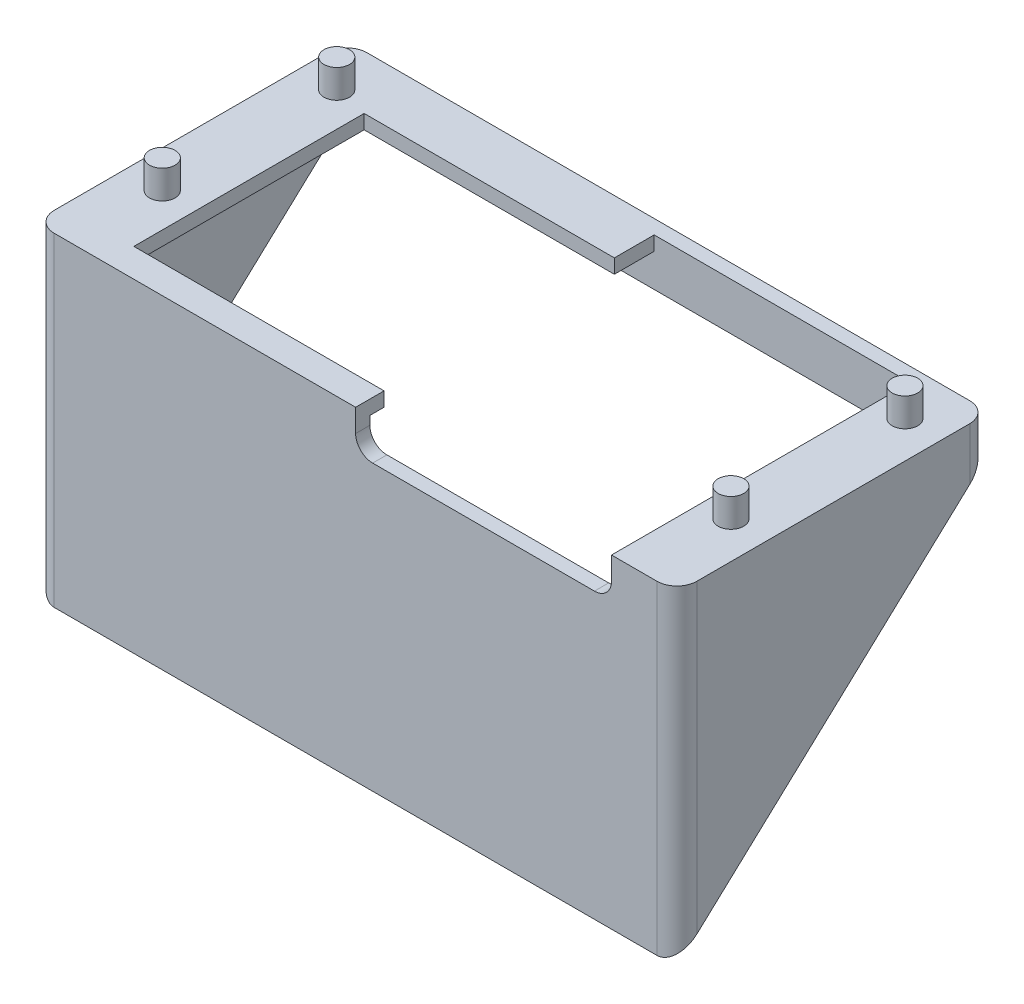
ISO-10303-21;
HEADER;
FILE_DESCRIPTION(('STEP AP214'),'2;1');
FILE_NAME('part.step','',(''),(''),'','','');
FILE_SCHEMA(('AUTOMOTIVE_DESIGN { 1 0 10303 214 1 1 1 1 }'));
ENDSEC;
DATA;
#1=APPLICATION_CONTEXT('core data for automotive mechanical design processes');
#2=APPLICATION_PROTOCOL_DEFINITION('international standard','automotive_design',2000,#1);
#3=PRODUCT_CONTEXT('',#1,'mechanical');
#4=PRODUCT('Part','Part','',(#3));
#5=PRODUCT_RELATED_PRODUCT_CATEGORY('part','',(#4));
#6=PRODUCT_DEFINITION_FORMATION('','',#4);
#7=PRODUCT_DEFINITION_CONTEXT('part definition',#1,'design');
#8=PRODUCT_DEFINITION('design','',#6,#7);
#9=PRODUCT_DEFINITION_SHAPE('','',#8);
#10=(LENGTH_UNIT() NAMED_UNIT(*) SI_UNIT(.MILLI.,.METRE.));
#11=(NAMED_UNIT(*) PLANE_ANGLE_UNIT() SI_UNIT($,.RADIAN.));
#12=(NAMED_UNIT(*) SI_UNIT($,.STERADIAN.) SOLID_ANGLE_UNIT());
#13=UNCERTAINTY_MEASURE_WITH_UNIT(LENGTH_MEASURE(1.E-05),#10,'distance_accuracy_value','');
#14=(GEOMETRIC_REPRESENTATION_CONTEXT(3) GLOBAL_UNCERTAINTY_ASSIGNED_CONTEXT((#13)) GLOBAL_UNIT_ASSIGNED_CONTEXT((#10,
#11,#12)) REPRESENTATION_CONTEXT('',''));
#15=CARTESIAN_POINT('',(0.,0.,0.));
#16=DIRECTION('',(0.,0.,1.));
#17=DIRECTION('',(1.,0.,0.));
#18=AXIS2_PLACEMENT_3D('',#15,#16,#17);
#19=CARTESIAN_POINT('',(0.,3.5,0.));
#20=DIRECTION('',(0.,1.,0.));
#21=DIRECTION('',(0.,0.,1.));
#22=AXIS2_PLACEMENT_3D('',#19,#20,#21);
#23=PLANE('',#22);
#24=DIRECTION('',(1.,0.,0.));
#25=VECTOR('',#24,1.);
#26=CARTESIAN_POINT('',(0.,3.5,9.97047970479705));
#27=LINE('',#26,#25);
#28=CARTESIAN_POINT('',(-40.0387453874539,3.5,9.97047970479705));
#29=VERTEX_POINT('',#28);
#30=CARTESIAN_POINT('',(3.96125461254611,3.5,9.97047970479705));
#31=VERTEX_POINT('',#30);
#32=EDGE_CURVE('E334',#29,#31,#27,.T.);
#33=ORIENTED_EDGE('',*,*,#32,.T.);
#34=DIRECTION('',(0.,0.,1.));
#35=VECTOR('',#34,1.);
#36=CARTESIAN_POINT('',(3.96125461254611,3.5,0.));
#37=LINE('',#36,#35);
#38=CARTESIAN_POINT('',(3.96125461254611,3.5,12.470479704797));
#39=VERTEX_POINT('',#38);
#40=EDGE_CURVE('E329',#31,#39,#37,.T.);
#41=ORIENTED_EDGE('',*,*,#40,.T.);
#42=DIRECTION('',(1.,0.,0.));
#43=VECTOR('',#42,1.);
#44=CARTESIAN_POINT('',(-52.5387453874539,3.5,12.470479704797));
#45=LINE('',#44,#43);
#46=CARTESIAN_POINT('',(-50.0387453874539,3.5,12.470479704797));
#47=VERTEX_POINT('',#46);
#48=EDGE_CURVE('E371',#47,#39,#45,.T.);
#49=ORIENTED_EDGE('',*,*,#48,.F.);
#50=DIRECTION('',(0.,0.,1.));
#51=VECTOR('',#50,1.);
#52=CARTESIAN_POINT('',(-50.0387453874539,3.5,-40.0295202952029));
#53=LINE('',#52,#51);
#54=CARTESIAN_POINT('',(-50.0387453874539,3.5,-37.5295202952029));
#55=VERTEX_POINT('',#54);
#56=EDGE_CURVE('E364',#55,#47,#53,.T.);
#57=ORIENTED_EDGE('',*,*,#56,.F.);
#58=DIRECTION('',(-1.,0.,0.));
#59=VECTOR('',#58,1.);
#60=CARTESIAN_POINT('',(-52.5387453874539,3.5,-37.5295202952029));
#61=LINE('',#60,#59);
#62=CARTESIAN_POINT('',(3.96125461254612,3.5,-37.5295202952029));
#63=VERTEX_POINT('',#62);
#64=EDGE_CURVE('E378',#63,#55,#61,.T.);
#65=ORIENTED_EDGE('',*,*,#64,.F.);
#66=DIRECTION('',(0.,0.,-1.));
#67=VECTOR('',#66,1.);
#68=CARTESIAN_POINT('',(3.96125461254612,3.5,0.));
#69=LINE('',#68,#67);
#70=CARTESIAN_POINT('',(3.96125461254612,3.5,-30.5295202952029));
#71=VERTEX_POINT('',#70);
#72=EDGE_CURVE('E342',#71,#63,#69,.T.);
#73=ORIENTED_EDGE('',*,*,#72,.F.);
#74=DIRECTION('',(1.,0.,0.));
#75=VECTOR('',#74,1.);
#76=CARTESIAN_POINT('',(0.,3.5,-30.5295202952029));
#77=LINE('',#76,#75);
#78=CARTESIAN_POINT('',(-40.0387453874539,3.5,-30.5295202952029));
#79=VERTEX_POINT('',#78);
#80=EDGE_CURVE('E340',#79,#71,#77,.T.);
#81=ORIENTED_EDGE('',*,*,#80,.F.);
#82=DIRECTION('',(0.,0.,-1.));
#83=VECTOR('',#82,1.);
#84=CARTESIAN_POINT('',(-40.0387453874539,3.5,0.));
#85=LINE('',#84,#83);
#86=EDGE_CURVE('E337',#29,#79,#85,.T.);
#87=ORIENTED_EDGE('',*,*,#86,.F.);
#88=EDGE_LOOP('',(#33,#41,#49,#57,#65,#73,#81,#87));
#89=FACE_BOUND('',#88,.T.);
#90=ADVANCED_FACE('F39',(#89),#23,.F.);
#91=CARTESIAN_POINT('',(0.,6.,0.));
#92=DIRECTION('',(0.,1.,0.));
#93=DIRECTION('',(0.,0.,1.));
#94=AXIS2_PLACEMENT_3D('',#91,#92,#93);
#95=PLANE('',#94);
#96=DIRECTION('',(0.,0.,1.));
#97=VECTOR('',#96,1.);
#98=CARTESIAN_POINT('',(3.96125461254611,6.,-83.0707104421457));
#99=LINE('',#98,#97);
#100=CARTESIAN_POINT('',(3.96125461254611,6.,9.97047970479704));
#101=VERTEX_POINT('',#100);
#102=CARTESIAN_POINT('',(3.96125461254611,6.,14.970479704797));
#103=VERTEX_POINT('',#102);
#104=EDGE_CURVE('E219',#101,#103,#99,.T.);
#105=ORIENTED_EDGE('',*,*,#104,.F.);
#106=DIRECTION('',(-1.,0.,0.));
#107=VECTOR('',#106,1.);
#108=CARTESIAN_POINT('',(0.,6.,9.97047970479705));
#109=LINE('',#108,#107);
#110=CARTESIAN_POINT('',(-40.0387453874539,6.,9.97047970479705));
#111=VERTEX_POINT('',#110);
#112=EDGE_CURVE('E241',#101,#111,#109,.T.);
#113=ORIENTED_EDGE('',*,*,#112,.T.);
#114=DIRECTION('',(0.,0.,1.));
#115=VECTOR('',#114,1.);
#116=CARTESIAN_POINT('',(-40.0387453874539,6.,0.));
#117=LINE('',#116,#115);
#118=CARTESIAN_POINT('',(-40.0387453874539,6.,-30.5295202952029));
#119=VERTEX_POINT('',#118);
#120=EDGE_CURVE('E246',#119,#111,#117,.T.);
#121=ORIENTED_EDGE('',*,*,#120,.F.);
#122=DIRECTION('',(-1.,0.,0.));
#123=VECTOR('',#122,1.);
#124=CARTESIAN_POINT('',(0.,6.,-30.5295202952029));
#125=LINE('',#124,#123);
#126=CARTESIAN_POINT('',(3.96125461254612,6.,-30.5295202952029));
#127=VERTEX_POINT('',#126);
#128=EDGE_CURVE('E249',#127,#119,#125,.T.);
#129=ORIENTED_EDGE('',*,*,#128,.F.);
#130=DIRECTION('',(0.,0.,1.));
#131=VECTOR('',#130,1.);
#132=CARTESIAN_POINT('',(3.96125461254612,6.,0.));
#133=LINE('',#132,#131);
#134=CARTESIAN_POINT('',(3.96125461254612,6.,-37.5295202952029));
#135=VERTEX_POINT('',#134);
#136=EDGE_CURVE('E251',#135,#127,#133,.T.);
#137=ORIENTED_EDGE('',*,*,#136,.F.);
#138=DIRECTION('',(-1.,0.,0.));
#139=VECTOR('',#138,1.);
#140=CARTESIAN_POINT('',(0.,6.,-37.5295202952029));
#141=LINE('',#140,#139);
#142=CARTESIAN_POINT('',(48.9612546125461,6.,-37.5295202952029));
#143=VERTEX_POINT('',#142);
#144=EDGE_CURVE('E217',#143,#135,#141,.T.);
#145=ORIENTED_EDGE('',*,*,#144,.F.);
#146=DIRECTION('',(0.,0.,1.));
#147=VECTOR('',#146,1.);
#148=CARTESIAN_POINT('',(48.9612546125461,6.,-83.0707104421457));
#149=LINE('',#148,#147);
#150=CARTESIAN_POINT('',(48.9612546125461,6.,14.970479704797));
#151=VERTEX_POINT('',#150);
#152=EDGE_CURVE('E204',#143,#151,#149,.T.);
#153=ORIENTED_EDGE('',*,*,#152,.T.);
#154=DIRECTION('',(1.,0.,0.));
#155=VECTOR('',#154,1.);
#156=CARTESIAN_POINT('',(-52.5387453874539,6.,14.970479704797));
#157=LINE('',#156,#155);
#158=CARTESIAN_POINT('',(56.9612546125461,6.,14.970479704797));
#159=VERTEX_POINT('',#158);
#160=EDGE_CURVE('E214',#151,#159,#157,.T.);
#161=ORIENTED_EDGE('',*,*,#160,.T.);
#162=CARTESIAN_POINT('',(56.9612546125461,6.,11.4704797047971));
#163=DIRECTION('',(0.,1.,0.));
#164=DIRECTION('',(0.,0.,1.));
#165=AXIS2_PLACEMENT_3D('',#162,#163,#164);
#166=CIRCLE('',#165,3.5);
#167=CARTESIAN_POINT('',(60.4612546125461,6.,11.4704797047971));
#168=VERTEX_POINT('',#167);
#169=EDGE_CURVE('E274',#159,#168,#166,.T.);
#170=ORIENTED_EDGE('',*,*,#169,.T.);
#171=DIRECTION('',(0.,0.,-1.));
#172=VECTOR('',#171,1.);
#173=CARTESIAN_POINT('',(60.4612546125461,6.,-40.0295202952029));
#174=LINE('',#173,#172);
#175=CARTESIAN_POINT('',(60.4612546125461,6.,-36.5295202952029));
#176=VERTEX_POINT('',#175);
#177=EDGE_CURVE('E230',#168,#176,#174,.T.);
#178=ORIENTED_EDGE('',*,*,#177,.T.);
#179=CARTESIAN_POINT('',(56.9612546125461,6.,-36.5295202952029));
#180=DIRECTION('',(0.,1.,0.));
#181=DIRECTION('',(0.,0.,1.));
#182=AXIS2_PLACEMENT_3D('',#179,#180,#181);
#183=CIRCLE('',#182,3.5);
#184=CARTESIAN_POINT('',(56.9612546125461,6.,-40.0295202952029));
#185=VERTEX_POINT('',#184);
#186=EDGE_CURVE('E276',#176,#185,#183,.T.);
#187=ORIENTED_EDGE('',*,*,#186,.T.);
#188=DIRECTION('',(-1.,0.,0.));
#189=VECTOR('',#188,1.);
#190=CARTESIAN_POINT('',(-52.5387453874539,6.,-40.0295202952029));
#191=LINE('',#190,#189);
#192=CARTESIAN_POINT('',(-49.0387453874539,6.,-40.0295202952029));
#193=VERTEX_POINT('',#192);
#194=EDGE_CURVE('E238',#185,#193,#191,.T.);
#195=ORIENTED_EDGE('',*,*,#194,.T.);
#196=CARTESIAN_POINT('',(-49.0387453874539,6.,-36.5295202952029));
#197=DIRECTION('',(0.,1.,0.));
#198=DIRECTION('',(0.,0.,1.));
#199=AXIS2_PLACEMENT_3D('',#196,#197,#198);
#200=CIRCLE('',#199,3.5);
#201=CARTESIAN_POINT('',(-52.5387453874539,6.,-36.5295202952029));
#202=VERTEX_POINT('',#201);
#203=EDGE_CURVE('E278',#193,#202,#200,.T.);
#204=ORIENTED_EDGE('',*,*,#203,.T.);
#205=DIRECTION('',(0.,0.,1.));
#206=VECTOR('',#205,1.);
#207=CARTESIAN_POINT('',(-52.5387453874539,6.,-40.0295202952029));
#208=LINE('',#207,#206);
#209=CARTESIAN_POINT('',(-52.5387453874539,6.,11.4704797047971));
#210=VERTEX_POINT('',#209);
#211=EDGE_CURVE('E227',#202,#210,#208,.T.);
#212=ORIENTED_EDGE('',*,*,#211,.T.);
#213=CARTESIAN_POINT('',(-49.0387453874539,6.,11.4704797047971));
#214=DIRECTION('',(0.,1.,0.));
#215=DIRECTION('',(0.,0.,1.));
#216=AXIS2_PLACEMENT_3D('',#213,#214,#215);
#217=CIRCLE('',#216,3.5);
#218=CARTESIAN_POINT('',(-49.0387453874539,6.,14.970479704797));
#219=VERTEX_POINT('',#218);
#220=EDGE_CURVE('E272',#210,#219,#217,.T.);
#221=ORIENTED_EDGE('',*,*,#220,.T.);
#222=EDGE_CURVE('E226',#219,#103,#157,.T.);
#223=ORIENTED_EDGE('',*,*,#222,.T.);
#224=EDGE_LOOP('',(#105,#113,#121,#129,#137,#145,#153,#161,#170,#178,#187,#195,#204,#212,#221,#223));
#225=FACE_BOUND('',#224,.T.);
#226=CARTESIAN_POINT('',(-46.0387453874539,6.,-1.02952029520295));
#227=DIRECTION('',(0.,1.,0.));
#228=DIRECTION('',(0.,0.,1.));
#229=AXIS2_PLACEMENT_3D('',#226,#227,#228);
#230=CIRCLE('',#229,2.25);
#231=CARTESIAN_POINT('',(-46.0387453874539,6.,1.22047970479705));
#232=VERTEX_POINT('',#231);
#233=EDGE_CURVE('E391',#232,#232,#230,.T.);
#234=ORIENTED_EDGE('',*,*,#233,.F.);
#235=EDGE_LOOP('',(#234));
#236=FACE_BOUND('',#235,.T.);
#237=CARTESIAN_POINT('',(53.9612546125461,6.,-1.02952029520295));
#238=DIRECTION('',(0.,1.,0.));
#239=DIRECTION('',(0.,0.,1.));
#240=AXIS2_PLACEMENT_3D('',#237,#238,#239);
#241=CIRCLE('',#240,2.25);
#242=CARTESIAN_POINT('',(53.9612546125461,6.,1.22047970479705));
#243=VERTEX_POINT('',#242);
#244=EDGE_CURVE('E397',#243,#243,#241,.T.);
#245=ORIENTED_EDGE('',*,*,#244,.F.);
#246=EDGE_LOOP('',(#245));
#247=FACE_BOUND('',#246,.T.);
#248=CARTESIAN_POINT('',(53.9612546125461,6.,-31.629520295203));
#249=DIRECTION('',(0.,1.,0.));
#250=DIRECTION('',(0.,0.,1.));
#251=AXIS2_PLACEMENT_3D('',#248,#249,#250);
#252=CIRCLE('',#251,2.25);
#253=CARTESIAN_POINT('',(53.9612546125461,6.,-29.379520295203));
#254=VERTEX_POINT('',#253);
#255=EDGE_CURVE('E403',#254,#254,#252,.T.);
#256=ORIENTED_EDGE('',*,*,#255,.F.);
#257=EDGE_LOOP('',(#256));
#258=FACE_BOUND('',#257,.T.);
#259=CARTESIAN_POINT('',(-46.0387453874539,6.,-31.7095202952029));
#260=DIRECTION('',(0.,1.,0.));
#261=DIRECTION('',(0.,0.,1.));
#262=AXIS2_PLACEMENT_3D('',#259,#260,#261);
#263=CIRCLE('',#262,2.25);
#264=CARTESIAN_POINT('',(-46.0387453874539,6.,-29.4595202952029));
#265=VERTEX_POINT('',#264);
#266=EDGE_CURVE('E406',#265,#265,#263,.T.);
#267=ORIENTED_EDGE('',*,*,#266,.F.);
#268=EDGE_LOOP('',(#267));
#269=FACE_BOUND('',#268,.T.);
#270=ADVANCED_FACE('F212',(#225,#236,#247,#258,#269),#95,.T.);
#271=CARTESIAN_POINT('',(-127.538745387454,-50.9901951359281,14.9704797047969));
#272=DIRECTION('',(0.,-0.73333333333333,-0.679869268479041));
#273=DIRECTION('',(0.,0.679869268479041,-0.733333333333331));
#274=AXIS2_PLACEMENT_3D('',#271,#272,#273);
#275=PLANE('',#274);
#276=DIRECTION('',(0.,-0.679869268479041,0.733333333333331));
#277=VECTOR('',#276,1.);
#278=CARTESIAN_POINT('',(-52.5387453874539,-50.9901951359281,14.9704797047969));
#279=LINE('',#278,#277);
#280=CARTESIAN_POINT('',(-52.5387453874539,-3.24483059955902,-36.5295202952029));
#281=VERTEX_POINT('',#280);
#282=CARTESIAN_POINT('',(-52.5387453874539,-47.7453645363691,11.4704797047971));
#283=VERTEX_POINT('',#282);
#284=EDGE_CURVE('E244',#281,#283,#279,.T.);
#285=ORIENTED_EDGE('',*,*,#284,.F.);
#286=CARTESIAN_POINT('',(-49.0387453874539,-3.24483059955902,-36.5295202952029));
#287=DIRECTION('',(0.,-0.73333333333333,-0.679869268479041));
#288=DIRECTION('',(0.,-0.679869268479041,0.733333333333331));
#289=AXIS2_PLACEMENT_3D('',#286,#287,#288);
#290=ELLIPSE('',#289,4.77272727272729,3.5);
#291=CARTESIAN_POINT('',(-49.0387453874539,0.,-40.0295202952029));
#292=VERTEX_POINT('',#291);
#293=EDGE_CURVE('E265',#281,#292,#290,.T.);
#294=ORIENTED_EDGE('',*,*,#293,.T.);
#295=DIRECTION('',(-1.,0.,0.));
#296=VECTOR('',#295,1.);
#297=CARTESIAN_POINT('',(-52.5387453874539,0.,-40.0295202952029));
#298=LINE('',#297,#296);
#299=CARTESIAN_POINT('',(56.9612546125461,0.,-40.0295202952029));
#300=VERTEX_POINT('',#299);
#301=EDGE_CURVE('E232',#300,#292,#298,.T.);
#302=ORIENTED_EDGE('',*,*,#301,.F.);
#303=CARTESIAN_POINT('',(56.9612546125461,-3.24483059955905,-36.5295202952029));
#304=DIRECTION('',(0.,-0.73333333333333,-0.679869268479041));
#305=DIRECTION('',(0.,-0.679869268479041,0.733333333333331));
#306=AXIS2_PLACEMENT_3D('',#303,#304,#305);
#307=ELLIPSE('',#306,4.77272727272729,3.5);
#308=CARTESIAN_POINT('',(60.4612546125461,-3.24483059955905,-36.5295202952029));
#309=VERTEX_POINT('',#308);
#310=EDGE_CURVE('E263',#300,#309,#307,.T.);
#311=ORIENTED_EDGE('',*,*,#310,.T.);
#312=DIRECTION('',(0.,0.679869268479041,-0.733333333333331));
#313=VECTOR('',#312,1.);
#314=CARTESIAN_POINT('',(60.4612546125461,-50.9901951359281,14.9704797047969));
#315=LINE('',#314,#313);
#316=CARTESIAN_POINT('',(60.4612546125461,-47.7453645363692,11.4704797047971));
#317=VERTEX_POINT('',#316);
#318=EDGE_CURVE('E412',#317,#309,#315,.T.);
#319=ORIENTED_EDGE('',*,*,#318,.F.);
#320=CARTESIAN_POINT('',(56.9612546125461,-47.7453645363692,11.4704797047971));
#321=DIRECTION('',(0.,-0.73333333333333,-0.679869268479041));
#322=DIRECTION('',(0.,-0.679869268479041,0.733333333333331));
#323=AXIS2_PLACEMENT_3D('',#320,#321,#322);
#324=ELLIPSE('',#323,4.77272727272729,3.5);
#325=CARTESIAN_POINT('',(56.9612546125461,-50.9901951359281,14.9704797047969));
#326=VERTEX_POINT('',#325);
#327=EDGE_CURVE('E261',#317,#326,#324,.T.);
#328=ORIENTED_EDGE('',*,*,#327,.T.);
#329=DIRECTION('',(1.,0.,0.));
#330=VECTOR('',#329,1.);
#331=CARTESIAN_POINT('',(-127.538745387454,-50.9901951359281,14.9704797047969));
#332=LINE('',#331,#330);
#333=CARTESIAN_POINT('',(-49.0387453874539,-50.9901951359281,14.9704797047969));
#334=VERTEX_POINT('',#333);
#335=EDGE_CURVE('E417',#334,#326,#332,.T.);
#336=ORIENTED_EDGE('',*,*,#335,.F.);
#337=CARTESIAN_POINT('',(-49.0387453874539,-47.7453645363691,11.4704797047971));
#338=DIRECTION('',(0.,-0.73333333333333,-0.679869268479041));
#339=DIRECTION('',(0.,-0.679869268479041,0.733333333333331));
#340=AXIS2_PLACEMENT_3D('',#337,#338,#339);
#341=ELLIPSE('',#340,4.77272727272729,3.5);
#342=EDGE_CURVE('E259',#334,#283,#341,.T.);
#343=ORIENTED_EDGE('',*,*,#342,.T.);
#344=EDGE_LOOP('',(#285,#294,#302,#311,#319,#328,#336,#343));
#345=FACE_BOUND('',#344,.T.);
#346=DIRECTION('',(-1.,0.,0.));
#347=VECTOR('',#346,1.);
#348=CARTESIAN_POINT('',(-127.538745387454,-2.31773614254212,-37.529520295203));
#349=LINE('',#348,#347);
#350=CARTESIAN_POINT('',(57.9612546125461,-2.31773614254217,-37.5295202952029));
#351=VERTEX_POINT('',#350);
#352=CARTESIAN_POINT('',(-50.0387453874539,-2.31773614254214,-37.5295202952029));
#353=VERTEX_POINT('',#352);
#354=EDGE_CURVE('E368',#351,#353,#349,.T.);
#355=ORIENTED_EDGE('',*,*,#354,.T.);
#356=DIRECTION('',(0.,-0.679869268479041,0.733333333333331));
#357=VECTOR('',#356,1.);
#358=CARTESIAN_POINT('',(-50.0387453874539,-50.9901951359281,14.9704797047969));
#359=LINE('',#358,#357);
#360=CARTESIAN_POINT('',(-50.0387453874539,-48.672458993386,12.470479704797));
#361=VERTEX_POINT('',#360);
#362=EDGE_CURVE('E381',#353,#361,#359,.T.);
#363=ORIENTED_EDGE('',*,*,#362,.T.);
#364=DIRECTION('',(1.,0.,0.));
#365=VECTOR('',#364,1.);
#366=CARTESIAN_POINT('',(-127.538745387454,-48.672458993386,12.470479704797));
#367=LINE('',#366,#365);
#368=CARTESIAN_POINT('',(57.9612546125461,-48.6724589933861,12.470479704797));
#369=VERTEX_POINT('',#368);
#370=EDGE_CURVE('E384',#361,#369,#367,.T.);
#371=ORIENTED_EDGE('',*,*,#370,.T.);
#372=DIRECTION('',(0.,0.679869268479041,-0.733333333333331));
#373=VECTOR('',#372,1.);
#374=CARTESIAN_POINT('',(57.9612546125461,-50.9901951359281,14.9704797047969));
#375=LINE('',#374,#373);
#376=EDGE_CURVE('E348',#369,#351,#375,.T.);
#377=ORIENTED_EDGE('',*,*,#376,.T.);
#378=EDGE_LOOP('',(#355,#363,#371,#377));
#379=FACE_BOUND('',#378,.T.);
#380=ADVANCED_FACE('F486',(#345,#379),#275,.T.);
#381=CARTESIAN_POINT('',(-52.5387453874539,6.,-40.0295202952029));
#382=DIRECTION('',(1.,0.,0.));
#383=DIRECTION('',(0.,0.,-1.));
#384=AXIS2_PLACEMENT_3D('',#381,#382,#383);
#385=PLANE('',#384);
#386=ORIENTED_EDGE('',*,*,#211,.F.);
#387=DIRECTION('',(0.,-1.,0.));
#388=VECTOR('',#387,1.);
#389=CARTESIAN_POINT('',(-52.5387453874539,6.,-36.5295202952029));
#390=LINE('',#389,#388);
#391=EDGE_CURVE('E256',#202,#281,#390,.T.);
#392=ORIENTED_EDGE('',*,*,#391,.T.);
#393=ORIENTED_EDGE('',*,*,#284,.T.);
#394=DIRECTION('',(0.,-1.,0.));
#395=VECTOR('',#394,1.);
#396=CARTESIAN_POINT('',(-52.5387453874539,6.,11.4704797047971));
#397=LINE('',#396,#395);
#398=EDGE_CURVE('E254',#283,#210,#397,.F.);
#399=ORIENTED_EDGE('',*,*,#398,.T.);
#400=EDGE_LOOP('',(#386,#392,#393,#399));
#401=FACE_BOUND('',#400,.T.);
#402=ADVANCED_FACE('F447',(#401),#385,.F.);
#403=CARTESIAN_POINT('',(-52.5387453874539,6.,14.970479704797));
#404=DIRECTION('',(0.,0.,-1.));
#405=DIRECTION('',(-1.,0.,0.));
#406=AXIS2_PLACEMENT_3D('',#403,#404,#405);
#407=PLANE('',#406);
#408=DIRECTION('',(1.,0.,0.));
#409=VECTOR('',#408,1.);
#410=CARTESIAN_POINT('',(3.96125461254611,-1.,14.970479704797));
#411=LINE('',#410,#409);
#412=CARTESIAN_POINT('',(6.96125461254611,-1.,14.970479704797));
#413=VERTEX_POINT('',#412);
#414=CARTESIAN_POINT('',(45.9612546125461,-1.,14.970479704797));
#415=VERTEX_POINT('',#414);
#416=EDGE_CURVE('E208',#413,#415,#411,.T.);
#417=ORIENTED_EDGE('',*,*,#416,.F.);
#418=CARTESIAN_POINT('',(6.96125461254611,2.,14.970479704797));
#419=DIRECTION('',(0.,0.,-1.));
#420=DIRECTION('',(-1.,0.,0.));
#421=AXIS2_PLACEMENT_3D('',#418,#419,#420);
#422=CIRCLE('',#421,3.);
#423=CARTESIAN_POINT('',(3.96125461254611,2.,14.970479704797));
#424=VERTEX_POINT('',#423);
#425=EDGE_CURVE('E47',#413,#424,#422,.T.);
#426=ORIENTED_EDGE('',*,*,#425,.T.);
#427=DIRECTION('',(0.,-1.,0.));
#428=VECTOR('',#427,1.);
#429=CARTESIAN_POINT('',(3.96125461254611,6.,14.970479704797));
#430=LINE('',#429,#428);
#431=EDGE_CURVE('E322',#103,#424,#430,.T.);
#432=ORIENTED_EDGE('',*,*,#431,.F.);
#433=ORIENTED_EDGE('',*,*,#222,.F.);
#434=DIRECTION('',(0.,-1.,0.));
#435=VECTOR('',#434,1.);
#436=CARTESIAN_POINT('',(-49.0387453874539,6.,14.970479704797));
#437=LINE('',#436,#435);
#438=EDGE_CURVE('E285',#219,#334,#437,.T.);
#439=ORIENTED_EDGE('',*,*,#438,.T.);
#440=ORIENTED_EDGE('',*,*,#335,.T.);
#441=DIRECTION('',(0.,-1.,0.));
#442=VECTOR('',#441,1.);
#443=CARTESIAN_POINT('',(56.9612546125461,6.,14.970479704797));
#444=LINE('',#443,#442);
#445=EDGE_CURVE('E224',#326,#159,#444,.F.);
#446=ORIENTED_EDGE('',*,*,#445,.T.);
#447=ORIENTED_EDGE('',*,*,#160,.F.);
#448=DIRECTION('',(0.,1.,0.));
#449=VECTOR('',#448,1.);
#450=CARTESIAN_POINT('',(48.9612546125461,6.,14.970479704797));
#451=LINE('',#450,#449);
#452=CARTESIAN_POINT('',(48.9612546125461,2.,14.970479704797));
#453=VERTEX_POINT('',#452);
#454=EDGE_CURVE('E200',#453,#151,#451,.T.);
#455=ORIENTED_EDGE('',*,*,#454,.F.);
#456=CARTESIAN_POINT('',(45.9612546125461,2.,14.970479704797));
#457=DIRECTION('',(0.,0.,-1.));
#458=DIRECTION('',(-1.,0.,0.));
#459=AXIS2_PLACEMENT_3D('',#456,#457,#458);
#460=CIRCLE('',#459,3.);
#461=EDGE_CURVE('E301',#453,#415,#460,.T.);
#462=ORIENTED_EDGE('',*,*,#461,.T.);
#463=EDGE_LOOP('',(#417,#426,#432,#433,#439,#440,#446,#447,#455,#462));
#464=FACE_BOUND('',#463,.T.);
#465=ADVANCED_FACE('F221',(#464),#407,.F.);
#466=CARTESIAN_POINT('',(60.4612546125461,6.,-40.0295202952029));
#467=DIRECTION('',(-1.,0.,0.));
#468=DIRECTION('',(0.,0.,1.));
#469=AXIS2_PLACEMENT_3D('',#466,#467,#468);
#470=PLANE('',#469);
#471=ORIENTED_EDGE('',*,*,#318,.T.);
#472=DIRECTION('',(0.,-1.,0.));
#473=VECTOR('',#472,1.);
#474=CARTESIAN_POINT('',(60.4612546125461,6.,-36.5295202952029));
#475=LINE('',#474,#473);
#476=EDGE_CURVE('E283',#309,#176,#475,.F.);
#477=ORIENTED_EDGE('',*,*,#476,.T.);
#478=ORIENTED_EDGE('',*,*,#177,.F.);
#479=DIRECTION('',(0.,-1.,0.));
#480=VECTOR('',#479,1.);
#481=CARTESIAN_POINT('',(60.4612546125461,6.,11.4704797047971));
#482=LINE('',#481,#480);
#483=EDGE_CURVE('E280',#168,#317,#482,.T.);
#484=ORIENTED_EDGE('',*,*,#483,.T.);
#485=EDGE_LOOP('',(#471,#477,#478,#484));
#486=FACE_BOUND('',#485,.T.);
#487=ADVANCED_FACE('F429',(#486),#470,.F.);
#488=CARTESIAN_POINT('',(-52.5387453874539,6.,-40.0295202952029));
#489=DIRECTION('',(0.,0.,1.));
#490=DIRECTION('',(1.,0.,0.));
#491=AXIS2_PLACEMENT_3D('',#488,#489,#490);
#492=PLANE('',#491);
#493=ORIENTED_EDGE('',*,*,#301,.T.);
#494=DIRECTION('',(0.,-1.,0.));
#495=VECTOR('',#494,1.);
#496=CARTESIAN_POINT('',(-49.0387453874539,6.,-40.0295202952029));
#497=LINE('',#496,#495);
#498=EDGE_CURVE('E270',#292,#193,#497,.F.);
#499=ORIENTED_EDGE('',*,*,#498,.T.);
#500=ORIENTED_EDGE('',*,*,#194,.F.);
#501=DIRECTION('',(0.,-1.,0.));
#502=VECTOR('',#501,1.);
#503=CARTESIAN_POINT('',(56.9612546125461,6.,-40.0295202952029));
#504=LINE('',#503,#502);
#505=EDGE_CURVE('E267',#185,#300,#504,.T.);
#506=ORIENTED_EDGE('',*,*,#505,.T.);
#507=EDGE_LOOP('',(#493,#499,#500,#506));
#508=FACE_BOUND('',#507,.T.);
#509=ADVANCED_FACE('F438',(#508),#492,.F.);
#510=CARTESIAN_POINT('',(-46.0387453874539,11.,-31.7095202952029));
#511=DIRECTION('',(0.,-1.,0.));
#512=DIRECTION('',(0.,0.,-1.));
#513=AXIS2_PLACEMENT_3D('',#510,#511,#512);
#514=CYLINDRICAL_SURFACE('',#513,2.25);
#515=CARTESIAN_POINT('',(-46.0387453874539,11.,-31.7095202952029));
#516=DIRECTION('',(0.,1.,0.));
#517=DIRECTION('',(0.,0.,1.));
#518=AXIS2_PLACEMENT_3D('',#515,#516,#517);
#519=CIRCLE('',#518,2.25);
#520=CARTESIAN_POINT('',(-46.0387453874539,11.,-29.4595202952029));
#521=VERTEX_POINT('',#520);
#522=EDGE_CURVE('E409',#521,#521,#519,.T.);
#523=ORIENTED_EDGE('',*,*,#522,.F.);
#524=EDGE_LOOP('',(#523));
#525=FACE_BOUND('',#524,.T.);
#526=ORIENTED_EDGE('',*,*,#266,.T.);
#527=EDGE_LOOP('',(#526));
#528=FACE_BOUND('',#527,.T.);
#529=ADVANCED_FACE('F519',(#525,#528),#514,.T.);
#530=CARTESIAN_POINT('',(-46.0387453874539,11.,-31.7095202952029));
#531=DIRECTION('',(0.,1.,0.));
#532=DIRECTION('',(0.,0.,1.));
#533=AXIS2_PLACEMENT_3D('',#530,#531,#532);
#534=PLANE('',#533);
#535=ORIENTED_EDGE('',*,*,#522,.T.);
#536=EDGE_LOOP('',(#535));
#537=FACE_BOUND('',#536,.T.);
#538=ADVANCED_FACE('F767',(#537),#534,.T.);
#539=CARTESIAN_POINT('',(53.9612546125461,11.,-31.629520295203));
#540=DIRECTION('',(0.,-1.,0.));
#541=DIRECTION('',(0.,0.,-1.));
#542=AXIS2_PLACEMENT_3D('',#539,#540,#541);
#543=CYLINDRICAL_SURFACE('',#542,2.25);
#544=CARTESIAN_POINT('',(53.9612546125461,11.,-31.629520295203));
#545=DIRECTION('',(0.,1.,0.));
#546=DIRECTION('',(0.,0.,1.));
#547=AXIS2_PLACEMENT_3D('',#544,#545,#546);
#548=CIRCLE('',#547,2.25);
#549=CARTESIAN_POINT('',(53.9612546125461,11.,-29.379520295203));
#550=VERTEX_POINT('',#549);
#551=EDGE_CURVE('E400',#550,#550,#548,.T.);
#552=ORIENTED_EDGE('',*,*,#551,.F.);
#553=EDGE_LOOP('',(#552));
#554=FACE_BOUND('',#553,.T.);
#555=ORIENTED_EDGE('',*,*,#255,.T.);
#556=EDGE_LOOP('',(#555));
#557=FACE_BOUND('',#556,.T.);
#558=ADVANCED_FACE('F757',(#554,#557),#543,.T.);
#559=CARTESIAN_POINT('',(53.9612546125461,11.,-31.629520295203));
#560=DIRECTION('',(0.,1.,0.));
#561=DIRECTION('',(0.,0.,1.));
#562=AXIS2_PLACEMENT_3D('',#559,#560,#561);
#563=PLANE('',#562);
#564=ORIENTED_EDGE('',*,*,#551,.T.);
#565=EDGE_LOOP('',(#564));
#566=FACE_BOUND('',#565,.T.);
#567=ADVANCED_FACE('F747',(#566),#563,.T.);
#568=CARTESIAN_POINT('',(53.9612546125461,11.,-1.02952029520295));
#569=DIRECTION('',(0.,-1.,0.));
#570=DIRECTION('',(0.,0.,-1.));
#571=AXIS2_PLACEMENT_3D('',#568,#569,#570);
#572=CYLINDRICAL_SURFACE('',#571,2.25);
#573=CARTESIAN_POINT('',(53.9612546125461,11.,-1.02952029520295));
#574=DIRECTION('',(0.,1.,0.));
#575=DIRECTION('',(0.,0.,1.));
#576=AXIS2_PLACEMENT_3D('',#573,#574,#575);
#577=CIRCLE('',#576,2.25);
#578=CARTESIAN_POINT('',(53.9612546125461,11.,1.22047970479705));
#579=VERTEX_POINT('',#578);
#580=EDGE_CURVE('E394',#579,#579,#577,.T.);
#581=ORIENTED_EDGE('',*,*,#580,.F.);
#582=EDGE_LOOP('',(#581));
#583=FACE_BOUND('',#582,.T.);
#584=ORIENTED_EDGE('',*,*,#244,.T.);
#585=EDGE_LOOP('',(#584));
#586=FACE_BOUND('',#585,.T.);
#587=ADVANCED_FACE('F737',(#583,#586),#572,.T.);
#588=CARTESIAN_POINT('',(53.9612546125461,11.,-1.02952029520295));
#589=DIRECTION('',(0.,1.,0.));
#590=DIRECTION('',(0.,0.,1.));
#591=AXIS2_PLACEMENT_3D('',#588,#589,#590);
#592=PLANE('',#591);
#593=ORIENTED_EDGE('',*,*,#580,.T.);
#594=EDGE_LOOP('',(#593));
#595=FACE_BOUND('',#594,.T.);
#596=ADVANCED_FACE('F728',(#595),#592,.T.);
#597=CARTESIAN_POINT('',(-46.0387453874539,11.,-1.02952029520295));
#598=DIRECTION('',(0.,-1.,0.));
#599=DIRECTION('',(0.,0.,-1.));
#600=AXIS2_PLACEMENT_3D('',#597,#598,#599);
#601=CYLINDRICAL_SURFACE('',#600,2.25);
#602=CARTESIAN_POINT('',(-46.0387453874539,11.,-1.02952029520295));
#603=DIRECTION('',(0.,1.,0.));
#604=DIRECTION('',(0.,0.,1.));
#605=AXIS2_PLACEMENT_3D('',#602,#603,#604);
#606=CIRCLE('',#605,2.25);
#607=CARTESIAN_POINT('',(-46.0387453874539,11.,1.22047970479705));
#608=VERTEX_POINT('',#607);
#609=EDGE_CURVE('E362',#608,#608,#606,.T.);
#610=ORIENTED_EDGE('',*,*,#609,.F.);
#611=EDGE_LOOP('',(#610));
#612=FACE_BOUND('',#611,.T.);
#613=ORIENTED_EDGE('',*,*,#233,.T.);
#614=EDGE_LOOP('',(#613));
#615=FACE_BOUND('',#614,.T.);
#616=ADVANCED_FACE('F718',(#612,#615),#601,.T.);
#617=CARTESIAN_POINT('',(-46.0387453874539,11.,-1.02952029520295));
#618=DIRECTION('',(0.,1.,0.));
#619=DIRECTION('',(0.,0.,1.));
#620=AXIS2_PLACEMENT_3D('',#617,#618,#619);
#621=PLANE('',#620);
#622=ORIENTED_EDGE('',*,*,#609,.T.);
#623=EDGE_LOOP('',(#622));
#624=FACE_BOUND('',#623,.T.);
#625=ADVANCED_FACE('F552',(#624),#621,.T.);
#626=CARTESIAN_POINT('',(-50.0387453874539,6.,-40.0295202952029));
#627=DIRECTION('',(1.,0.,0.));
#628=DIRECTION('',(0.,0.,-1.));
#629=AXIS2_PLACEMENT_3D('',#626,#627,#628);
#630=PLANE('',#629);
#631=DIRECTION('',(0.,-1.,0.));
#632=VECTOR('',#631,1.);
#633=CARTESIAN_POINT('',(-50.0387453874539,6.,-37.5295202952029));
#634=LINE('',#633,#632);
#635=EDGE_CURVE('E355',#55,#353,#634,.T.);
#636=ORIENTED_EDGE('',*,*,#635,.F.);
#637=ORIENTED_EDGE('',*,*,#56,.T.);
#638=DIRECTION('',(0.,-1.,0.));
#639=VECTOR('',#638,1.);
#640=CARTESIAN_POINT('',(-50.0387453874539,6.,12.470479704797));
#641=LINE('',#640,#639);
#642=EDGE_CURVE('E360',#47,#361,#641,.T.);
#643=ORIENTED_EDGE('',*,*,#642,.T.);
#644=ORIENTED_EDGE('',*,*,#362,.F.);
#645=EDGE_LOOP('',(#636,#637,#643,#644));
#646=FACE_BOUND('',#645,.T.);
#647=ADVANCED_FACE('F483',(#646),#630,.T.);
#648=CARTESIAN_POINT('',(-52.5387453874539,6.,12.470479704797));
#649=DIRECTION('',(0.,0.,-1.));
#650=DIRECTION('',(-1.,0.,0.));
#651=AXIS2_PLACEMENT_3D('',#648,#649,#650);
#652=PLANE('',#651);
#653=DIRECTION('',(0.,1.,0.));
#654=VECTOR('',#653,1.);
#655=CARTESIAN_POINT('',(3.96125461254611,6.,12.470479704797));
#656=LINE('',#655,#654);
#657=CARTESIAN_POINT('',(3.96125461254611,2.,12.470479704797));
#658=VERTEX_POINT('',#657);
#659=EDGE_CURVE('E315',#658,#39,#656,.T.);
#660=ORIENTED_EDGE('',*,*,#659,.F.);
#661=CARTESIAN_POINT('',(6.96125461254611,2.,12.470479704797));
#662=DIRECTION('',(0.,0.,-1.));
#663=DIRECTION('',(-1.,0.,0.));
#664=AXIS2_PLACEMENT_3D('',#661,#662,#663);
#665=CIRCLE('',#664,3.);
#666=CARTESIAN_POINT('',(6.96125461254611,-1.,12.470479704797));
#667=VERTEX_POINT('',#666);
#668=EDGE_CURVE('E11',#658,#667,#665,.F.);
#669=ORIENTED_EDGE('',*,*,#668,.T.);
#670=DIRECTION('',(-1.,0.,0.));
#671=VECTOR('',#670,1.);
#672=CARTESIAN_POINT('',(-52.5387453874539,-1.,12.470479704797));
#673=LINE('',#672,#671);
#674=CARTESIAN_POINT('',(45.9612546125461,-1.,12.470479704797));
#675=VERTEX_POINT('',#674);
#676=EDGE_CURVE('E312',#675,#667,#673,.T.);
#677=ORIENTED_EDGE('',*,*,#676,.F.);
#678=CARTESIAN_POINT('',(45.9612546125461,2.,12.470479704797));
#679=DIRECTION('',(0.,0.,-1.));
#680=DIRECTION('',(-1.,0.,0.));
#681=AXIS2_PLACEMENT_3D('',#678,#679,#680);
#682=CIRCLE('',#681,3.);
#683=CARTESIAN_POINT('',(48.9612546125461,2.,12.470479704797));
#684=VERTEX_POINT('',#683);
#685=EDGE_CURVE('E303',#675,#684,#682,.F.);
#686=ORIENTED_EDGE('',*,*,#685,.T.);
#687=DIRECTION('',(0.,-1.,0.));
#688=VECTOR('',#687,1.);
#689=CARTESIAN_POINT('',(48.9612546125461,6.,12.470479704797));
#690=LINE('',#689,#688);
#691=CARTESIAN_POINT('',(48.9612546125461,3.5,12.470479704797));
#692=VERTEX_POINT('',#691);
#693=EDGE_CURVE('E309',#692,#684,#690,.T.);
#694=ORIENTED_EDGE('',*,*,#693,.F.);
#695=CARTESIAN_POINT('',(57.9612546125461,3.5,12.470479704797));
#696=VERTEX_POINT('',#695);
#697=EDGE_CURVE('E367',#692,#696,#45,.T.);
#698=ORIENTED_EDGE('',*,*,#697,.T.);
#699=DIRECTION('',(0.,-1.,0.));
#700=VECTOR('',#699,1.);
#701=CARTESIAN_POINT('',(57.9612546125461,6.,12.470479704797));
#702=LINE('',#701,#700);
#703=EDGE_CURVE('E363',#696,#369,#702,.T.);
#704=ORIENTED_EDGE('',*,*,#703,.T.);
#705=ORIENTED_EDGE('',*,*,#370,.F.);
#706=ORIENTED_EDGE('',*,*,#642,.F.);
#707=ORIENTED_EDGE('',*,*,#48,.T.);
#708=EDGE_LOOP('',(#660,#669,#677,#686,#694,#698,#704,#705,#706,#707));
#709=FACE_BOUND('',#708,.T.);
#710=ADVANCED_FACE('F308',(#709),#652,.T.);
#711=CARTESIAN_POINT('',(57.9612546125461,6.,-40.0295202952029));
#712=DIRECTION('',(-1.,0.,0.));
#713=DIRECTION('',(0.,0.,1.));
#714=AXIS2_PLACEMENT_3D('',#711,#712,#713);
#715=PLANE('',#714);
#716=ORIENTED_EDGE('',*,*,#703,.F.);
#717=DIRECTION('',(0.,0.,-1.));
#718=VECTOR('',#717,1.);
#719=CARTESIAN_POINT('',(57.9612546125461,3.5,-40.0295202952029));
#720=LINE('',#719,#718);
#721=CARTESIAN_POINT('',(57.9612546125461,3.5,-37.5295202952029));
#722=VERTEX_POINT('',#721);
#723=EDGE_CURVE('E374',#696,#722,#720,.T.);
#724=ORIENTED_EDGE('',*,*,#723,.T.);
#725=DIRECTION('',(0.,-1.,0.));
#726=VECTOR('',#725,1.);
#727=CARTESIAN_POINT('',(57.9612546125461,6.,-37.5295202952029));
#728=LINE('',#727,#726);
#729=EDGE_CURVE('E358',#722,#351,#728,.T.);
#730=ORIENTED_EDGE('',*,*,#729,.T.);
#731=ORIENTED_EDGE('',*,*,#376,.F.);
#732=EDGE_LOOP('',(#716,#724,#730,#731));
#733=FACE_BOUND('',#732,.T.);
#734=ADVANCED_FACE('F491',(#733),#715,.T.);
#735=CARTESIAN_POINT('',(-52.5387453874539,6.,-37.5295202952029));
#736=DIRECTION('',(0.,0.,1.));
#737=DIRECTION('',(1.,0.,0.));
#738=AXIS2_PLACEMENT_3D('',#735,#736,#737);
#739=PLANE('',#738);
#740=CARTESIAN_POINT('',(48.9612546125461,3.5,-37.5295202952029));
#741=VERTEX_POINT('',#740);
#742=EDGE_CURVE('E359',#722,#741,#61,.T.);
#743=ORIENTED_EDGE('',*,*,#742,.T.);
#744=DIRECTION('',(0.,-1.,0.));
#745=VECTOR('',#744,1.);
#746=CARTESIAN_POINT('',(48.9612546125461,6.,-37.5295202952029));
#747=LINE('',#746,#745);
#748=EDGE_CURVE('E327',#143,#741,#747,.T.);
#749=ORIENTED_EDGE('',*,*,#748,.F.);
#750=ORIENTED_EDGE('',*,*,#144,.T.);
#751=DIRECTION('',(0.,-1.,0.));
#752=VECTOR('',#751,1.);
#753=CARTESIAN_POINT('',(3.96125461254612,13.5,-37.5295202952029));
#754=LINE('',#753,#752);
#755=EDGE_CURVE('E346',#135,#63,#754,.T.);
#756=ORIENTED_EDGE('',*,*,#755,.T.);
#757=ORIENTED_EDGE('',*,*,#64,.T.);
#758=ORIENTED_EDGE('',*,*,#635,.T.);
#759=ORIENTED_EDGE('',*,*,#354,.F.);
#760=ORIENTED_EDGE('',*,*,#729,.F.);
#761=EDGE_LOOP('',(#743,#749,#750,#756,#757,#758,#759,#760));
#762=FACE_BOUND('',#761,.T.);
#763=ADVANCED_FACE('F481',(#762),#739,.T.);
#764=ORIENTED_EDGE('',*,*,#697,.F.);
#765=DIRECTION('',(0.,0.,-1.));
#766=VECTOR('',#765,1.);
#767=CARTESIAN_POINT('',(48.9612546125461,3.5,0.));
#768=LINE('',#767,#766);
#769=EDGE_CURVE('E291',#692,#741,#768,.T.);
#770=ORIENTED_EDGE('',*,*,#769,.T.);
#771=ORIENTED_EDGE('',*,*,#742,.F.);
#772=ORIENTED_EDGE('',*,*,#723,.F.);
#773=EDGE_LOOP('',(#764,#770,#771,#772));
#774=FACE_BOUND('',#773,.T.);
#775=ADVANCED_FACE('F494',(#774),#23,.F.);
#776=CARTESIAN_POINT('',(3.96125461254612,13.5,0.));
#777=DIRECTION('',(-1.,0.,0.));
#778=DIRECTION('',(0.,0.,1.));
#779=AXIS2_PLACEMENT_3D('',#776,#777,#778);
#780=PLANE('',#779);
#781=ORIENTED_EDGE('',*,*,#136,.T.);
#782=DIRECTION('',(0.,-1.,0.));
#783=VECTOR('',#782,1.);
#784=CARTESIAN_POINT('',(3.96125461254612,13.5,-30.5295202952029));
#785=LINE('',#784,#783);
#786=EDGE_CURVE('E349',#127,#71,#785,.T.);
#787=ORIENTED_EDGE('',*,*,#786,.T.);
#788=ORIENTED_EDGE('',*,*,#72,.T.);
#789=ORIENTED_EDGE('',*,*,#755,.F.);
#790=EDGE_LOOP('',(#781,#787,#788,#789));
#791=FACE_BOUND('',#790,.T.);
#792=ADVANCED_FACE('F476',(#791),#780,.F.);
#793=CARTESIAN_POINT('',(0.,13.5,-30.5295202952029));
#794=DIRECTION('',(0.,0.,-1.));
#795=DIRECTION('',(-1.,0.,0.));
#796=AXIS2_PLACEMENT_3D('',#793,#794,#795);
#797=PLANE('',#796);
#798=ORIENTED_EDGE('',*,*,#128,.T.);
#799=DIRECTION('',(0.,-1.,0.));
#800=VECTOR('',#799,1.);
#801=CARTESIAN_POINT('',(-40.0387453874539,13.5,-30.5295202952029));
#802=LINE('',#801,#800);
#803=EDGE_CURVE('E352',#119,#79,#802,.T.);
#804=ORIENTED_EDGE('',*,*,#803,.T.);
#805=ORIENTED_EDGE('',*,*,#80,.T.);
#806=ORIENTED_EDGE('',*,*,#786,.F.);
#807=EDGE_LOOP('',(#798,#804,#805,#806));
#808=FACE_BOUND('',#807,.T.);
#809=ADVANCED_FACE('F472',(#808),#797,.F.);
#810=CARTESIAN_POINT('',(-40.0387453874539,13.5,0.));
#811=DIRECTION('',(-1.,0.,0.));
#812=DIRECTION('',(0.,0.,1.));
#813=AXIS2_PLACEMENT_3D('',#810,#811,#812);
#814=PLANE('',#813);
#815=ORIENTED_EDGE('',*,*,#120,.T.);
#816=DIRECTION('',(0.,-1.,0.));
#817=VECTOR('',#816,1.);
#818=CARTESIAN_POINT('',(-40.0387453874539,13.5,9.97047970479705));
#819=LINE('',#818,#817);
#820=EDGE_CURVE('E345',#111,#29,#819,.T.);
#821=ORIENTED_EDGE('',*,*,#820,.T.);
#822=ORIENTED_EDGE('',*,*,#86,.T.);
#823=ORIENTED_EDGE('',*,*,#803,.F.);
#824=EDGE_LOOP('',(#815,#821,#822,#823));
#825=FACE_BOUND('',#824,.T.);
#826=ADVANCED_FACE('F470',(#825),#814,.F.);
#827=CARTESIAN_POINT('',(0.,13.5,9.97047970479705));
#828=DIRECTION('',(0.,0.,-1.));
#829=DIRECTION('',(-1.,0.,0.));
#830=AXIS2_PLACEMENT_3D('',#827,#828,#829);
#831=PLANE('',#830);
#832=DIRECTION('',(0.,1.,0.));
#833=VECTOR('',#832,1.);
#834=CARTESIAN_POINT('',(3.96125461254611,13.5,9.97047970479705));
#835=LINE('',#834,#833);
#836=EDGE_CURVE('E289',#31,#101,#835,.T.);
#837=ORIENTED_EDGE('',*,*,#836,.F.);
#838=ORIENTED_EDGE('',*,*,#32,.F.);
#839=ORIENTED_EDGE('',*,*,#820,.F.);
#840=ORIENTED_EDGE('',*,*,#112,.F.);
#841=EDGE_LOOP('',(#837,#838,#839,#840));
#842=FACE_BOUND('',#841,.T.);
#843=ADVANCED_FACE('F464',(#842),#831,.T.);
#844=CARTESIAN_POINT('',(-49.0387453874539,6.,-36.5295202952029));
#845=DIRECTION('',(0.,-1.,0.));
#846=DIRECTION('',(0.,0.,-1.));
#847=AXIS2_PLACEMENT_3D('',#844,#845,#846);
#848=CYLINDRICAL_SURFACE('',#847,3.5);
#849=ORIENTED_EDGE('',*,*,#203,.F.);
#850=ORIENTED_EDGE('',*,*,#498,.F.);
#851=ORIENTED_EDGE('',*,*,#293,.F.);
#852=ORIENTED_EDGE('',*,*,#391,.F.);
#853=EDGE_LOOP('',(#849,#850,#851,#852));
#854=FACE_BOUND('',#853,.T.);
#855=ADVANCED_FACE('F442',(#854),#848,.T.);
#856=CARTESIAN_POINT('',(56.9612546125461,6.,-36.5295202952029));
#857=DIRECTION('',(0.,-1.,0.));
#858=DIRECTION('',(0.,0.,-1.));
#859=AXIS2_PLACEMENT_3D('',#856,#857,#858);
#860=CYLINDRICAL_SURFACE('',#859,3.5);
#861=ORIENTED_EDGE('',*,*,#186,.F.);
#862=ORIENTED_EDGE('',*,*,#476,.F.);
#863=ORIENTED_EDGE('',*,*,#310,.F.);
#864=ORIENTED_EDGE('',*,*,#505,.F.);
#865=EDGE_LOOP('',(#861,#862,#863,#864));
#866=FACE_BOUND('',#865,.T.);
#867=ADVANCED_FACE('F433',(#866),#860,.T.);
#868=CARTESIAN_POINT('',(56.9612546125461,6.,11.4704797047971));
#869=DIRECTION('',(0.,-1.,0.));
#870=DIRECTION('',(0.,0.,-1.));
#871=AXIS2_PLACEMENT_3D('',#868,#869,#870);
#872=CYLINDRICAL_SURFACE('',#871,3.5);
#873=ORIENTED_EDGE('',*,*,#169,.F.);
#874=ORIENTED_EDGE('',*,*,#445,.F.);
#875=ORIENTED_EDGE('',*,*,#327,.F.);
#876=ORIENTED_EDGE('',*,*,#483,.F.);
#877=EDGE_LOOP('',(#873,#874,#875,#876));
#878=FACE_BOUND('',#877,.T.);
#879=ADVANCED_FACE('F424',(#878),#872,.T.);
#880=CARTESIAN_POINT('',(-49.0387453874539,6.,11.4704797047971));
#881=DIRECTION('',(0.,-1.,0.));
#882=DIRECTION('',(0.,0.,-1.));
#883=AXIS2_PLACEMENT_3D('',#880,#881,#882);
#884=CYLINDRICAL_SURFACE('',#883,3.5);
#885=ORIENTED_EDGE('',*,*,#220,.F.);
#886=ORIENTED_EDGE('',*,*,#398,.F.);
#887=ORIENTED_EDGE('',*,*,#342,.F.);
#888=ORIENTED_EDGE('',*,*,#438,.F.);
#889=EDGE_LOOP('',(#885,#886,#887,#888));
#890=FACE_BOUND('',#889,.T.);
#891=ADVANCED_FACE('F451',(#890),#884,.T.);
#892=CARTESIAN_POINT('',(3.96125461254611,6.,-83.0707104421457));
#893=DIRECTION('',(-1.,0.,0.));
#894=DIRECTION('',(0.,0.,1.));
#895=AXIS2_PLACEMENT_3D('',#892,#893,#894);
#896=PLANE('',#895);
#897=ORIENTED_EDGE('',*,*,#431,.T.);
#898=DIRECTION('',(0.,0.,1.));
#899=VECTOR('',#898,1.);
#900=CARTESIAN_POINT('',(3.96125461254611,2.,12.470479704797));
#901=LINE('',#900,#899);
#902=EDGE_CURVE('E60',#424,#658,#901,.F.);
#903=ORIENTED_EDGE('',*,*,#902,.T.);
#904=ORIENTED_EDGE('',*,*,#659,.T.);
#905=ORIENTED_EDGE('',*,*,#40,.F.);
#906=ORIENTED_EDGE('',*,*,#836,.T.);
#907=ORIENTED_EDGE('',*,*,#104,.T.);
#908=EDGE_LOOP('',(#897,#903,#904,#905,#906,#907));
#909=FACE_BOUND('',#908,.T.);
#910=ADVANCED_FACE('F452',(#909),#896,.F.);
#911=CARTESIAN_POINT('',(48.9612546125461,6.,-83.0707104421457));
#912=DIRECTION('',(1.,0.,0.));
#913=DIRECTION('',(0.,0.,-1.));
#914=AXIS2_PLACEMENT_3D('',#911,#912,#913);
#915=PLANE('',#914);
#916=ORIENTED_EDGE('',*,*,#693,.T.);
#917=DIRECTION('',(0.,0.,1.));
#918=VECTOR('',#917,1.);
#919=CARTESIAN_POINT('',(48.9612546125461,2.,14.970479704797));
#920=LINE('',#919,#918);
#921=EDGE_CURVE('E206',#684,#453,#920,.T.);
#922=ORIENTED_EDGE('',*,*,#921,.T.);
#923=ORIENTED_EDGE('',*,*,#454,.T.);
#924=ORIENTED_EDGE('',*,*,#152,.F.);
#925=ORIENTED_EDGE('',*,*,#748,.T.);
#926=ORIENTED_EDGE('',*,*,#769,.F.);
#927=EDGE_LOOP('',(#916,#922,#923,#924,#925,#926));
#928=FACE_BOUND('',#927,.T.);
#929=ADVANCED_FACE('F203',(#928),#915,.F.);
#930=CARTESIAN_POINT('',(3.96125461254611,-1.,-83.0707104421457));
#931=DIRECTION('',(0.,-1.,0.));
#932=DIRECTION('',(1.,0.,0.));
#933=AXIS2_PLACEMENT_3D('',#930,#931,#932);
#934=PLANE('',#933);
#935=ORIENTED_EDGE('',*,*,#416,.T.);
#936=DIRECTION('',(0.,0.,1.));
#937=VECTOR('',#936,1.);
#938=CARTESIAN_POINT('',(45.9612546125461,-1.,12.470479704797));
#939=LINE('',#938,#937);
#940=EDGE_CURVE('E298',#415,#675,#939,.F.);
#941=ORIENTED_EDGE('',*,*,#940,.T.);
#942=ORIENTED_EDGE('',*,*,#676,.T.);
#943=DIRECTION('',(0.,0.,1.));
#944=VECTOR('',#943,1.);
#945=CARTESIAN_POINT('',(6.96125461254611,-1.,14.970479704797));
#946=LINE('',#945,#944);
#947=EDGE_CURVE('E295',#667,#413,#946,.T.);
#948=ORIENTED_EDGE('',*,*,#947,.T.);
#949=EDGE_LOOP('',(#935,#941,#942,#948));
#950=FACE_BOUND('',#949,.T.);
#951=ADVANCED_FACE('F320',(#950),#934,.F.);
#952=CARTESIAN_POINT('',(45.9612546125461,2.,-83.0707104421457));
#953=DIRECTION('',(0.,0.,-1.));
#954=DIRECTION('',(-1.,0.,0.));
#955=AXIS2_PLACEMENT_3D('',#952,#953,#954);
#956=CYLINDRICAL_SURFACE('',#955,3.);
#957=ORIENTED_EDGE('',*,*,#685,.F.);
#958=ORIENTED_EDGE('',*,*,#940,.F.);
#959=ORIENTED_EDGE('',*,*,#461,.F.);
#960=ORIENTED_EDGE('',*,*,#921,.F.);
#961=EDGE_LOOP('',(#957,#958,#959,#960));
#962=FACE_BOUND('',#961,.T.);
#963=ADVANCED_FACE('F317',(#962),#956,.F.);
#964=CARTESIAN_POINT('',(6.96125461254611,2.,-83.0707104421457));
#965=DIRECTION('',(0.,0.,-1.));
#966=DIRECTION('',(-1.,0.,0.));
#967=AXIS2_PLACEMENT_3D('',#964,#965,#966);
#968=CYLINDRICAL_SURFACE('',#967,3.);
#969=ORIENTED_EDGE('',*,*,#668,.F.);
#970=ORIENTED_EDGE('',*,*,#902,.F.);
#971=ORIENTED_EDGE('',*,*,#425,.F.);
#972=ORIENTED_EDGE('',*,*,#947,.F.);
#973=EDGE_LOOP('',(#969,#970,#971,#972));
#974=FACE_BOUND('',#973,.T.);
#975=ADVANCED_FACE('F41',(#974),#968,.F.);
#976=CLOSED_SHELL('',(#90,#270,#380,#402,#465,#487,#509,#529,#538,#558,#567,#587,#596,#616,#625,
#647,#710,#734,#763,#775,#792,#809,#826,#843,#855,#867,#879,#891,#910,#929,#951,#963,#975));
#977=MANIFOLD_SOLID_BREP('B2',#976);
#978=ADVANCED_BREP_SHAPE_REPRESENTATION('',(#18,#977),#14);
#979=SHAPE_DEFINITION_REPRESENTATION(#9,#978);
ENDSEC;
END-ISO-10303-21;
